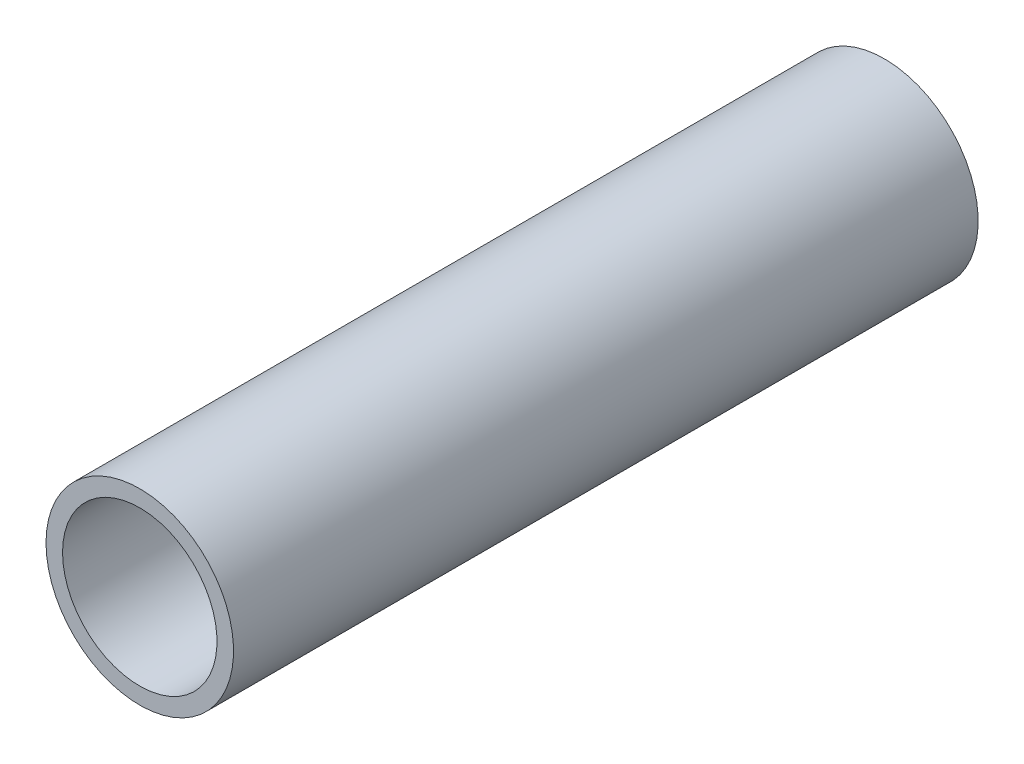
ISO-10303-21;
HEADER;
FILE_DESCRIPTION(('STEP AP214'),'2;1');
FILE_NAME('part.step','',(''),(''),'','','');
FILE_SCHEMA(('AUTOMOTIVE_DESIGN { 1 0 10303 214 1 1 1 1 }'));
ENDSEC;
DATA;
#1=APPLICATION_CONTEXT('core data for automotive mechanical design processes');
#2=APPLICATION_PROTOCOL_DEFINITION('international standard','automotive_design',2000,#1);
#3=PRODUCT_CONTEXT('',#1,'mechanical');
#4=PRODUCT('Part','Part','',(#3));
#5=PRODUCT_RELATED_PRODUCT_CATEGORY('part','',(#4));
#6=PRODUCT_DEFINITION_FORMATION('','',#4);
#7=PRODUCT_DEFINITION_CONTEXT('part definition',#1,'design');
#8=PRODUCT_DEFINITION('design','',#6,#7);
#9=PRODUCT_DEFINITION_SHAPE('','',#8);
#10=(LENGTH_UNIT() NAMED_UNIT(*) SI_UNIT(.MILLI.,.METRE.));
#11=(NAMED_UNIT(*) PLANE_ANGLE_UNIT() SI_UNIT($,.RADIAN.));
#12=(NAMED_UNIT(*) SI_UNIT($,.STERADIAN.) SOLID_ANGLE_UNIT());
#13=UNCERTAINTY_MEASURE_WITH_UNIT(LENGTH_MEASURE(1.E-05),#10,'distance_accuracy_value','');
#14=(GEOMETRIC_REPRESENTATION_CONTEXT(3) GLOBAL_UNCERTAINTY_ASSIGNED_CONTEXT((#13)) GLOBAL_UNIT_ASSIGNED_CONTEXT((#10,
#11,#12)) REPRESENTATION_CONTEXT('',''));
#15=CARTESIAN_POINT('',(0.,0.,0.));
#16=DIRECTION('',(0.,0.,1.));
#17=DIRECTION('',(1.,0.,0.));
#18=AXIS2_PLACEMENT_3D('',#15,#16,#17);
#19=CARTESIAN_POINT('',(351.5,-25.0000000000017,108.083261120685));
#20=DIRECTION('',(0.,0.,-1.));
#21=DIRECTION('',(-1.,0.,0.));
#22=AXIS2_PLACEMENT_3D('',#19,#20,#21);
#23=CYLINDRICAL_SURFACE('',#22,17.);
#24=CARTESIAN_POINT('',(351.5,-25.0000000000017,40.));
#25=DIRECTION('',(0.,0.,-1.));
#26=DIRECTION('',(-1.,0.,0.));
#27=AXIS2_PLACEMENT_3D('',#24,#25,#26);
#28=CIRCLE('',#27,17.);
#29=CARTESIAN_POINT('',(334.5,-25.0000000000017,40.));
#30=VERTEX_POINT('',#29);
#31=EDGE_CURVE('E42',#30,#30,#28,.T.);
#32=CARTESIAN_POINT('',(351.5,-25.0000000000017,-95.));
#33=DIRECTION('',(0.,0.,-1.));
#34=DIRECTION('',(-1.,0.,0.));
#35=AXIS2_PLACEMENT_3D('',#32,#33,#34);
#36=CIRCLE('',#35,17.);
#37=CARTESIAN_POINT('',(334.5,-25.0000000000017,-95.));
#38=VERTEX_POINT('',#37);
#39=EDGE_CURVE('E53',#38,#38,#36,.F.);
#40=CARTESIAN_POINT('',(334.5,-25.0000000000017,40.));
#41=CARTESIAN_POINT('',(334.5,-25.0000000000017,38.59375));
#42=CARTESIAN_POINT('',(334.5,-25.0000000000017,37.1875));
#43=CARTESIAN_POINT('',(334.5,-25.0000000000017,34.375));
#44=CARTESIAN_POINT('',(334.5,-25.0000000000017,32.96875));
#45=CARTESIAN_POINT('',(334.5,-25.0000000000017,30.15625));
#46=CARTESIAN_POINT('',(334.5,-25.0000000000017,28.75));
#47=CARTESIAN_POINT('',(334.5,-25.0000000000017,25.9375));
#48=CARTESIAN_POINT('',(334.5,-25.0000000000017,24.53125));
#49=CARTESIAN_POINT('',(334.5,-25.0000000000017,21.71875));
#50=CARTESIAN_POINT('',(334.5,-25.0000000000017,20.3125));
#51=CARTESIAN_POINT('',(334.5,-25.0000000000017,17.5));
#52=CARTESIAN_POINT('',(334.5,-25.0000000000017,16.09375));
#53=CARTESIAN_POINT('',(334.5,-25.0000000000017,13.28125));
#54=CARTESIAN_POINT('',(334.5,-25.0000000000017,11.875));
#55=CARTESIAN_POINT('',(334.5,-25.0000000000017,9.06249999999997));
#56=CARTESIAN_POINT('',(334.5,-25.0000000000017,7.65624999999998));
#57=CARTESIAN_POINT('',(334.5,-25.0000000000017,4.84374999999998));
#58=CARTESIAN_POINT('',(334.5,-25.0000000000017,3.43749999999998));
#59=CARTESIAN_POINT('',(334.5,-25.0000000000017,0.624999999999982));
#60=CARTESIAN_POINT('',(334.5,-25.0000000000017,-0.78125000000002));
#61=CARTESIAN_POINT('',(334.5,-25.0000000000017,-3.59375000000002));
#62=CARTESIAN_POINT('',(334.5,-25.0000000000017,-5.00000000000003));
#63=CARTESIAN_POINT('',(334.5,-25.0000000000017,-7.81250000000003));
#64=CARTESIAN_POINT('',(334.5,-25.0000000000017,-9.21875000000002));
#65=CARTESIAN_POINT('',(334.5,-25.0000000000017,-12.03125));
#66=CARTESIAN_POINT('',(334.5,-25.0000000000017,-13.4375));
#67=CARTESIAN_POINT('',(334.5,-25.0000000000017,-16.25));
#68=CARTESIAN_POINT('',(334.5,-25.0000000000017,-17.65625));
#69=CARTESIAN_POINT('',(334.5,-25.0000000000017,-20.46875));
#70=CARTESIAN_POINT('',(334.5,-25.0000000000017,-21.875));
#71=CARTESIAN_POINT('',(334.5,-25.0000000000017,-24.6875));
#72=CARTESIAN_POINT('',(334.5,-25.0000000000017,-26.09375));
#73=CARTESIAN_POINT('',(334.5,-25.0000000000017,-28.90625));
#74=CARTESIAN_POINT('',(334.5,-25.0000000000017,-30.3125));
#75=CARTESIAN_POINT('',(334.5,-25.0000000000017,-33.125));
#76=CARTESIAN_POINT('',(334.5,-25.0000000000017,-34.53125));
#77=CARTESIAN_POINT('',(334.5,-25.0000000000017,-37.34375));
#78=CARTESIAN_POINT('',(334.5,-25.0000000000017,-38.75));
#79=CARTESIAN_POINT('',(334.5,-25.0000000000017,-41.5625));
#80=CARTESIAN_POINT('',(334.5,-25.0000000000017,-42.96875));
#81=CARTESIAN_POINT('',(334.5,-25.0000000000017,-45.78125));
#82=CARTESIAN_POINT('',(334.5,-25.0000000000017,-47.1875));
#83=CARTESIAN_POINT('',(334.5,-25.0000000000017,-50.));
#84=CARTESIAN_POINT('',(334.5,-25.0000000000017,-51.40625));
#85=CARTESIAN_POINT('',(334.5,-25.0000000000017,-54.21875));
#86=CARTESIAN_POINT('',(334.5,-25.0000000000017,-55.625));
#87=CARTESIAN_POINT('',(334.5,-25.0000000000017,-58.4375));
#88=CARTESIAN_POINT('',(334.5,-25.0000000000017,-59.84375));
#89=CARTESIAN_POINT('',(334.5,-25.0000000000017,-62.65625));
#90=CARTESIAN_POINT('',(334.5,-25.0000000000017,-64.0625));
#91=CARTESIAN_POINT('',(334.5,-25.0000000000017,-66.875));
#92=CARTESIAN_POINT('',(334.5,-25.0000000000017,-68.28125));
#93=CARTESIAN_POINT('',(334.5,-25.0000000000017,-71.09375));
#94=CARTESIAN_POINT('',(334.5,-25.0000000000017,-72.5));
#95=CARTESIAN_POINT('',(334.5,-25.0000000000017,-75.3125));
#96=CARTESIAN_POINT('',(334.5,-25.0000000000017,-76.71875));
#97=CARTESIAN_POINT('',(334.5,-25.0000000000017,-79.53125));
#98=CARTESIAN_POINT('',(334.5,-25.0000000000017,-80.9375));
#99=CARTESIAN_POINT('',(334.5,-25.0000000000017,-83.75));
#100=CARTESIAN_POINT('',(334.5,-25.0000000000017,-85.15625));
#101=CARTESIAN_POINT('',(334.5,-25.0000000000017,-87.96875));
#102=CARTESIAN_POINT('',(334.5,-25.0000000000017,-89.375));
#103=CARTESIAN_POINT('',(334.5,-25.0000000000017,-92.1875));
#104=CARTESIAN_POINT('',(334.5,-25.0000000000017,-93.59375));
#105=CARTESIAN_POINT('',(334.5,-25.0000000000017,-95.));
#106=B_SPLINE_CURVE_WITH_KNOTS('',3,(#40,#41,#42,#43,#44,#45,#46,#47,#48,#49,#50,#51,#52,#53,
#54,#55,#56,#57,#58,#59,#60,#61,#62,#63,#64,#65,#66,#67,#68,#69,#70,#71,#72,#73,#74,#75,#76,#77,
#78,#79,#80,#81,#82,#83,#84,#85,#86,#87,#88,#89,#90,#91,#92,#93,#94,#95,#96,#97,#98,#99,#100,
#101,#102,#103,#104,#105),.UNSPECIFIED.,.F.,.F.,(4,2,2,2,2,2,2,2,2,2,2,2,2,2,2,2,2,2,2,2,2,2,2,
2,2,2,2,2,2,2,2,2,4),(0.,4.21874999999999,8.4375,12.65625,16.875,21.09375,25.3125,29.53125,
33.75,37.96875,42.1875,46.40625,50.625,54.84375,59.0625,63.28125,67.5,71.71875,75.9375,80.15625,
84.375,88.59375,92.8125,97.03125,101.25,105.46875,109.6875,113.90625,118.125,122.34375,126.5625,
130.78125,135.),.UNSPECIFIED.);
#107=EDGE_CURVE('BSEAM34',#30,#38,#106,.T.);
#108=ORIENTED_EDGE('',*,*,#31,.T.);
#109=ORIENTED_EDGE('',*,*,#39,.T.);
#110=ORIENTED_EDGE('',*,*,#107,.T.);
#111=ORIENTED_EDGE('',*,*,#107,.F.);
#112=EDGE_LOOP('',(#108,#110,#109,#111));
#113=FACE_BOUND('',#112,.T.);
#114=ADVANCED_FACE('F34',(#113),#23,.T.);
#115=CARTESIAN_POINT('',(351.5,-25.0000000000017,108.083261120685));
#116=DIRECTION('',(0.,0.,-1.));
#117=DIRECTION('',(-1.,0.,0.));
#118=AXIS2_PLACEMENT_3D('',#115,#116,#117);
#119=CYLINDRICAL_SURFACE('',#118,14.);
#120=CARTESIAN_POINT('',(351.5,-25.0000000000017,40.));
#121=DIRECTION('',(0.,0.,-1.));
#122=DIRECTION('',(-1.,0.,0.));
#123=AXIS2_PLACEMENT_3D('',#120,#121,#122);
#124=CIRCLE('',#123,14.);
#125=CARTESIAN_POINT('',(337.5,-25.0000000000017,40.));
#126=VERTEX_POINT('',#125);
#127=EDGE_CURVE('E10',#126,#126,#124,.T.);
#128=CARTESIAN_POINT('',(351.5,-25.0000000000017,-95.));
#129=DIRECTION('',(0.,0.,-1.));
#130=DIRECTION('',(-1.,0.,0.));
#131=AXIS2_PLACEMENT_3D('',#128,#129,#130);
#132=CIRCLE('',#131,14.);
#133=CARTESIAN_POINT('',(337.5,-25.0000000000017,-95.));
#134=VERTEX_POINT('',#133);
#135=EDGE_CURVE('E48',#134,#134,#132,.F.);
#136=CARTESIAN_POINT('',(337.5,-25.0000000000017,40.));
#137=CARTESIAN_POINT('',(337.5,-25.0000000000017,38.59375));
#138=CARTESIAN_POINT('',(337.5,-25.0000000000017,37.1875));
#139=CARTESIAN_POINT('',(337.5,-25.0000000000017,34.375));
#140=CARTESIAN_POINT('',(337.5,-25.0000000000017,32.96875));
#141=CARTESIAN_POINT('',(337.5,-25.0000000000017,30.15625));
#142=CARTESIAN_POINT('',(337.5,-25.0000000000017,28.75));
#143=CARTESIAN_POINT('',(337.5,-25.0000000000017,25.9375));
#144=CARTESIAN_POINT('',(337.5,-25.0000000000017,24.53125));
#145=CARTESIAN_POINT('',(337.5,-25.0000000000017,21.71875));
#146=CARTESIAN_POINT('',(337.5,-25.0000000000017,20.3125));
#147=CARTESIAN_POINT('',(337.5,-25.0000000000017,17.5));
#148=CARTESIAN_POINT('',(337.5,-25.0000000000017,16.09375));
#149=CARTESIAN_POINT('',(337.5,-25.0000000000017,13.28125));
#150=CARTESIAN_POINT('',(337.5,-25.0000000000017,11.875));
#151=CARTESIAN_POINT('',(337.5,-25.0000000000017,9.06249999999997));
#152=CARTESIAN_POINT('',(337.5,-25.0000000000017,7.65624999999998));
#153=CARTESIAN_POINT('',(337.5,-25.0000000000017,4.84374999999998));
#154=CARTESIAN_POINT('',(337.5,-25.0000000000017,3.43749999999998));
#155=CARTESIAN_POINT('',(337.5,-25.0000000000017,0.624999999999982));
#156=CARTESIAN_POINT('',(337.5,-25.0000000000017,-0.78125000000002));
#157=CARTESIAN_POINT('',(337.5,-25.0000000000017,-3.59375000000002));
#158=CARTESIAN_POINT('',(337.5,-25.0000000000017,-5.00000000000003));
#159=CARTESIAN_POINT('',(337.5,-25.0000000000017,-7.81250000000003));
#160=CARTESIAN_POINT('',(337.5,-25.0000000000017,-9.21875000000002));
#161=CARTESIAN_POINT('',(337.5,-25.0000000000017,-12.03125));
#162=CARTESIAN_POINT('',(337.5,-25.0000000000017,-13.4375));
#163=CARTESIAN_POINT('',(337.5,-25.0000000000017,-16.25));
#164=CARTESIAN_POINT('',(337.5,-25.0000000000017,-17.65625));
#165=CARTESIAN_POINT('',(337.5,-25.0000000000017,-20.46875));
#166=CARTESIAN_POINT('',(337.5,-25.0000000000017,-21.875));
#167=CARTESIAN_POINT('',(337.5,-25.0000000000017,-24.6875));
#168=CARTESIAN_POINT('',(337.5,-25.0000000000017,-26.09375));
#169=CARTESIAN_POINT('',(337.5,-25.0000000000017,-28.90625));
#170=CARTESIAN_POINT('',(337.5,-25.0000000000017,-30.3125));
#171=CARTESIAN_POINT('',(337.5,-25.0000000000017,-33.125));
#172=CARTESIAN_POINT('',(337.5,-25.0000000000017,-34.53125));
#173=CARTESIAN_POINT('',(337.5,-25.0000000000017,-37.34375));
#174=CARTESIAN_POINT('',(337.5,-25.0000000000017,-38.75));
#175=CARTESIAN_POINT('',(337.5,-25.0000000000017,-41.5625));
#176=CARTESIAN_POINT('',(337.5,-25.0000000000017,-42.96875));
#177=CARTESIAN_POINT('',(337.5,-25.0000000000017,-45.78125));
#178=CARTESIAN_POINT('',(337.5,-25.0000000000017,-47.1875));
#179=CARTESIAN_POINT('',(337.5,-25.0000000000017,-50.));
#180=CARTESIAN_POINT('',(337.5,-25.0000000000017,-51.40625));
#181=CARTESIAN_POINT('',(337.5,-25.0000000000017,-54.21875));
#182=CARTESIAN_POINT('',(337.5,-25.0000000000017,-55.625));
#183=CARTESIAN_POINT('',(337.5,-25.0000000000017,-58.4375));
#184=CARTESIAN_POINT('',(337.5,-25.0000000000017,-59.84375));
#185=CARTESIAN_POINT('',(337.5,-25.0000000000017,-62.65625));
#186=CARTESIAN_POINT('',(337.5,-25.0000000000017,-64.0625));
#187=CARTESIAN_POINT('',(337.5,-25.0000000000017,-66.875));
#188=CARTESIAN_POINT('',(337.5,-25.0000000000017,-68.28125));
#189=CARTESIAN_POINT('',(337.5,-25.0000000000017,-71.09375));
#190=CARTESIAN_POINT('',(337.5,-25.0000000000017,-72.5));
#191=CARTESIAN_POINT('',(337.5,-25.0000000000017,-75.3125));
#192=CARTESIAN_POINT('',(337.5,-25.0000000000017,-76.71875));
#193=CARTESIAN_POINT('',(337.5,-25.0000000000017,-79.53125));
#194=CARTESIAN_POINT('',(337.5,-25.0000000000017,-80.9375));
#195=CARTESIAN_POINT('',(337.5,-25.0000000000017,-83.75));
#196=CARTESIAN_POINT('',(337.5,-25.0000000000017,-85.15625));
#197=CARTESIAN_POINT('',(337.5,-25.0000000000017,-87.96875));
#198=CARTESIAN_POINT('',(337.5,-25.0000000000017,-89.375));
#199=CARTESIAN_POINT('',(337.5,-25.0000000000017,-92.1875));
#200=CARTESIAN_POINT('',(337.5,-25.0000000000017,-93.59375));
#201=CARTESIAN_POINT('',(337.5,-25.0000000000017,-95.));
#202=B_SPLINE_CURVE_WITH_KNOTS('',3,(#136,#137,#138,#139,#140,#141,#142,#143,#144,#145,#146,
#147,#148,#149,#150,#151,#152,#153,#154,#155,#156,#157,#158,#159,#160,#161,#162,#163,#164,#165,
#166,#167,#168,#169,#170,#171,#172,#173,#174,#175,#176,#177,#178,#179,#180,#181,#182,#183,#184,
#185,#186,#187,#188,#189,#190,#191,#192,#193,#194,#195,#196,#197,#198,#199,#200,#201),
.UNSPECIFIED.,.F.,.F.,(4,2,2,2,2,2,2,2,2,2,2,2,2,2,2,2,2,2,2,2,2,2,2,2,2,2,2,2,2,2,2,2,4),(0.,
4.21874999999999,8.4375,12.65625,16.875,21.09375,25.3125,29.53125,33.75,37.96875,42.1875,
46.40625,50.625,54.84375,59.0625,63.28125,67.5,71.71875,75.9375,80.15625,84.375,88.59375,
92.8125,97.03125,101.25,105.46875,109.6875,113.90625,118.125,122.34375,126.5625,130.78125,135.),.UNSPECIFIED.);
#203=EDGE_CURVE('BSEAM66',#126,#134,#202,.T.);
#204=ORIENTED_EDGE('',*,*,#127,.F.);
#205=ORIENTED_EDGE('',*,*,#135,.F.);
#206=ORIENTED_EDGE('',*,*,#203,.T.);
#207=ORIENTED_EDGE('',*,*,#203,.F.);
#208=EDGE_LOOP('',(#204,#206,#205,#207));
#209=FACE_BOUND('',#208,.T.);
#210=ADVANCED_FACE('F66',(#209),#119,.F.);
#211=CARTESIAN_POINT('',(0.,679.999999999998,40.));
#212=DIRECTION('',(0.,0.,-1.));
#213=DIRECTION('',(-1.,0.,0.));
#214=AXIS2_PLACEMENT_3D('',#211,#212,#213);
#215=PLANE('',#214);
#216=ORIENTED_EDGE('',*,*,#127,.T.);
#217=EDGE_LOOP('',(#216));
#218=FACE_BOUND('',#217,.T.);
#219=ORIENTED_EDGE('',*,*,#31,.F.);
#220=EDGE_LOOP('',(#219));
#221=FACE_BOUND('',#220,.T.);
#222=ADVANCED_FACE('F36',(#218,#221),#215,.F.);
#223=CARTESIAN_POINT('',(0.,679.999999999998,-95.));
#224=DIRECTION('',(0.,0.,-1.));
#225=DIRECTION('',(-1.,0.,0.));
#226=AXIS2_PLACEMENT_3D('',#223,#224,#225);
#227=PLANE('',#226);
#228=ORIENTED_EDGE('',*,*,#39,.F.);
#229=EDGE_LOOP('',(#228));
#230=FACE_BOUND('',#229,.T.);
#231=ORIENTED_EDGE('',*,*,#135,.T.);
#232=EDGE_LOOP('',(#231));
#233=FACE_BOUND('',#232,.T.);
#234=ADVANCED_FACE('F60',(#230,#233),#227,.T.);
#235=CLOSED_SHELL('',(#114,#210,#222,#234));
#236=MANIFOLD_SOLID_BREP('B2',#235);
#237=ADVANCED_BREP_SHAPE_REPRESENTATION('',(#18,#236),#14);
#238=SHAPE_DEFINITION_REPRESENTATION(#9,#237);
ENDSEC;
END-ISO-10303-21;
